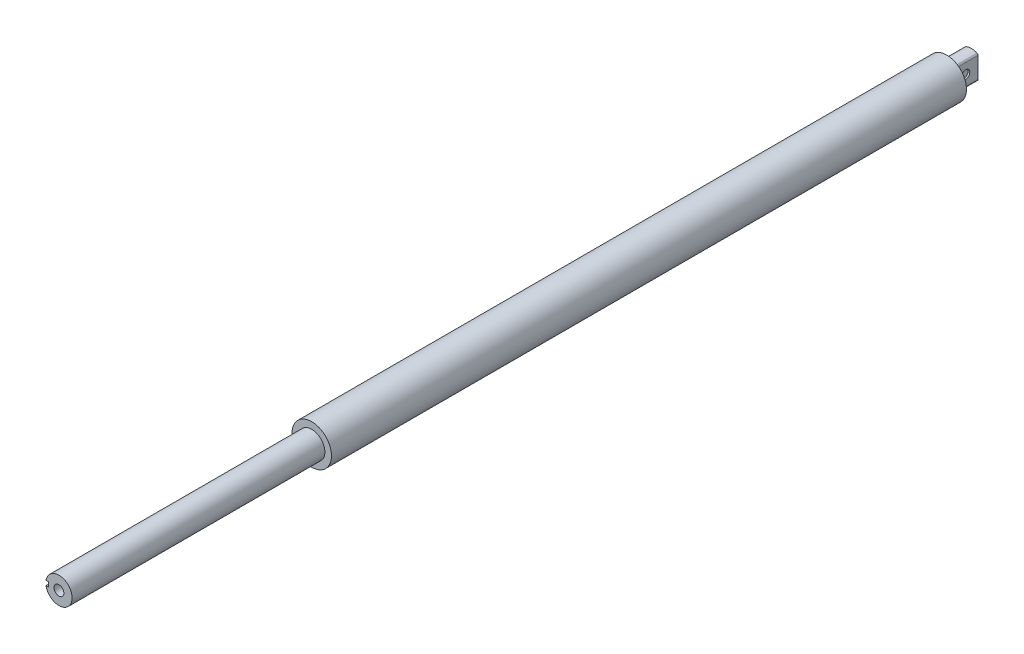
ISO-10303-21;
HEADER;
FILE_DESCRIPTION(('STEP AP214'),'2;1');
FILE_NAME('part.step','',(''),(''),'','','');
FILE_SCHEMA(('AUTOMOTIVE_DESIGN { 1 0 10303 214 1 1 1 1 }'));
ENDSEC;
DATA;
#1=APPLICATION_CONTEXT('core data for automotive mechanical design processes');
#2=APPLICATION_PROTOCOL_DEFINITION('international standard','automotive_design',2000,#1);
#3=PRODUCT_CONTEXT('',#1,'mechanical');
#4=PRODUCT('Part','Part','',(#3));
#5=PRODUCT_RELATED_PRODUCT_CATEGORY('part','',(#4));
#6=PRODUCT_DEFINITION_FORMATION('','',#4);
#7=PRODUCT_DEFINITION_CONTEXT('part definition',#1,'design');
#8=PRODUCT_DEFINITION('design','',#6,#7);
#9=PRODUCT_DEFINITION_SHAPE('','',#8);
#10=(LENGTH_UNIT() NAMED_UNIT(*) SI_UNIT(.MILLI.,.METRE.));
#11=(NAMED_UNIT(*) PLANE_ANGLE_UNIT() SI_UNIT($,.RADIAN.));
#12=(NAMED_UNIT(*) SI_UNIT($,.STERADIAN.) SOLID_ANGLE_UNIT());
#13=UNCERTAINTY_MEASURE_WITH_UNIT(LENGTH_MEASURE(1.E-05),#10,'distance_accuracy_value','');
#14=(GEOMETRIC_REPRESENTATION_CONTEXT(3) GLOBAL_UNCERTAINTY_ASSIGNED_CONTEXT((#13)) GLOBAL_UNIT_ASSIGNED_CONTEXT((#10,
#11,#12)) REPRESENTATION_CONTEXT('',''));
#15=CARTESIAN_POINT('',(0.,0.,0.));
#16=DIRECTION('',(0.,0.,1.));
#17=DIRECTION('',(1.,0.,0.));
#18=AXIS2_PLACEMENT_3D('',#15,#16,#17);
#19=CARTESIAN_POINT('',(0.,0.,-364.100348116694));
#20=DIRECTION('',(0.,0.,-1.));
#21=DIRECTION('',(-1.,0.,0.));
#22=AXIS2_PLACEMENT_3D('',#19,#20,#21);
#23=CYLINDRICAL_SURFACE('',#22,8.00000000000004);
#24=CARTESIAN_POINT('',(0.,0.,-277.5));
#25=DIRECTION('',(0.,0.,-1.));
#26=DIRECTION('',(-1.,0.,0.));
#27=AXIS2_PLACEMENT_3D('',#24,#25,#26);
#28=CIRCLE('',#27,8.00000000000004);
#29=CARTESIAN_POINT('',(-3.42857142857147,7.22806322324206,-277.5));
#30=VERTEX_POINT('',#29);
#31=CARTESIAN_POINT('',(3.42857142857138,7.22806322324206,-277.5));
#32=VERTEX_POINT('',#31);
#33=EDGE_CURVE('E167',#30,#32,#28,.T.);
#34=ORIENTED_EDGE('',*,*,#33,.F.);
#35=DIRECTION('',(0.,0.,-1.));
#36=VECTOR('',#35,1.);
#37=CARTESIAN_POINT('',(-3.42857142857147,7.22806322324206,-364.100348116694));
#38=LINE('',#37,#36);
#39=CARTESIAN_POINT('',(-3.42857142857147,7.22806322324206,-262.5));
#40=VERTEX_POINT('',#39);
#41=EDGE_CURVE('E52',#30,#40,#38,.F.);
#42=ORIENTED_EDGE('',*,*,#41,.T.);
#43=CARTESIAN_POINT('',(0.,0.,-262.5));
#44=DIRECTION('',(0.,0.,-1.));
#45=DIRECTION('',(-1.,0.,0.));
#46=AXIS2_PLACEMENT_3D('',#43,#44,#45);
#47=CIRCLE('',#46,8.00000000000004);
#48=CARTESIAN_POINT('',(3.42857142857138,7.22806322324206,-262.5));
#49=VERTEX_POINT('',#48);
#50=EDGE_CURVE('E168',#40,#49,#47,.T.);
#51=ORIENTED_EDGE('',*,*,#50,.T.);
#52=DIRECTION('',(0.,0.,-1.));
#53=VECTOR('',#52,1.);
#54=CARTESIAN_POINT('',(3.42857142857138,7.22806322324206,-364.100348116694));
#55=LINE('',#54,#53);
#56=EDGE_CURVE('E199',#49,#32,#55,.T.);
#57=ORIENTED_EDGE('',*,*,#56,.T.);
#58=EDGE_LOOP('',(#34,#42,#51,#57));
#59=FACE_BOUND('',#58,.T.);
#60=ADVANCED_FACE('F32',(#59),#23,.T.);
#61=CARTESIAN_POINT('',(0.,0.,-364.100348116694));
#62=DIRECTION('',(0.,0.,-1.));
#63=DIRECTION('',(-1.,0.,0.));
#64=AXIS2_PLACEMENT_3D('',#61,#62,#63);
#65=CYLINDRICAL_SURFACE('',#64,12.0000000000001);
#66=CARTESIAN_POINT('',(0.,0.,-262.5));
#67=DIRECTION('',(0.,0.,-1.));
#68=DIRECTION('',(-1.,0.,0.));
#69=AXIS2_PLACEMENT_3D('',#66,#67,#68);
#70=CIRCLE('',#69,12.0000000000001);
#71=CARTESIAN_POINT('',(-12.0000000000002,0.,-262.5));
#72=VERTEX_POINT('',#71);
#73=EDGE_CURVE('E170',#72,#72,#70,.T.);
#74=ORIENTED_EDGE('',*,*,#73,.F.);
#75=EDGE_LOOP('',(#74));
#76=FACE_BOUND('',#75,.T.);
#77=CARTESIAN_POINT('',(0.,0.,123.75));
#78=DIRECTION('',(0.,0.,1.));
#79=DIRECTION('',(1.,0.,0.));
#80=AXIS2_PLACEMENT_3D('',#77,#78,#79);
#81=CIRCLE('',#80,12.0000000000001);
#82=CARTESIAN_POINT('',(12.0000000000001,0.,123.75));
#83=VERTEX_POINT('',#82);
#84=EDGE_CURVE('E251',#83,#83,#81,.T.);
#85=ORIENTED_EDGE('',*,*,#84,.F.);
#86=EDGE_LOOP('',(#85));
#87=FACE_BOUND('',#86,.T.);
#88=ADVANCED_FACE('F281',(#76,#87),#65,.T.);
#89=CARTESIAN_POINT('',(12.0000000000001,0.,-262.5));
#90=DIRECTION('',(0.,0.,1.));
#91=DIRECTION('',(1.,0.,0.));
#92=AXIS2_PLACEMENT_3D('',#89,#90,#91);
#93=PLANE('',#92);
#94=ORIENTED_EDGE('',*,*,#50,.F.);
#95=CARTESIAN_POINT('',(-3.00000000000005,6.32455532033681,-262.5));
#96=DIRECTION('',(0.,0.,1.));
#97=DIRECTION('',(1.,0.,0.));
#98=AXIS2_PLACEMENT_3D('',#95,#96,#97);
#99=CIRCLE('',#98,1.);
#100=CARTESIAN_POINT('',(-4.00000000000005,6.32455532033681,-262.5));
#101=VERTEX_POINT('',#100);
#102=EDGE_CURVE('E40',#40,#101,#99,.T.);
#103=ORIENTED_EDGE('',*,*,#102,.T.);
#104=DIRECTION('',(0.,-1.,0.));
#105=VECTOR('',#104,1.);
#106=CARTESIAN_POINT('',(-4.00000000000005,-6.92820323027556,-262.5));
#107=LINE('',#106,#105);
#108=CARTESIAN_POINT('',(-4.00000000000005,-6.32455532033681,-262.5));
#109=VERTEX_POINT('',#108);
#110=EDGE_CURVE('E211',#101,#109,#107,.T.);
#111=ORIENTED_EDGE('',*,*,#110,.T.);
#112=CARTESIAN_POINT('',(-3.00000000000005,-6.32455532033681,-262.5));
#113=DIRECTION('',(0.,0.,1.));
#114=DIRECTION('',(1.,0.,0.));
#115=AXIS2_PLACEMENT_3D('',#112,#113,#114);
#116=CIRCLE('',#115,1.);
#117=CARTESIAN_POINT('',(-3.42857142857147,-7.22806322324206,-262.5));
#118=VERTEX_POINT('',#117);
#119=EDGE_CURVE('E205',#109,#118,#116,.T.);
#120=ORIENTED_EDGE('',*,*,#119,.T.);
#121=CARTESIAN_POINT('',(3.42857142857138,-7.22806322324206,-262.5));
#122=VERTEX_POINT('',#121);
#123=EDGE_CURVE('E171',#122,#118,#47,.T.);
#124=ORIENTED_EDGE('',*,*,#123,.F.);
#125=CARTESIAN_POINT('',(2.99999999999996,-6.32455532033681,-262.5));
#126=DIRECTION('',(0.,0.,1.));
#127=DIRECTION('',(1.,0.,0.));
#128=AXIS2_PLACEMENT_3D('',#125,#126,#127);
#129=CIRCLE('',#128,1.);
#130=CARTESIAN_POINT('',(3.99999999999996,-6.32455532033681,-262.5));
#131=VERTEX_POINT('',#130);
#132=EDGE_CURVE('E203',#122,#131,#129,.T.);
#133=ORIENTED_EDGE('',*,*,#132,.T.);
#134=DIRECTION('',(0.,1.,0.));
#135=VECTOR('',#134,1.);
#136=CARTESIAN_POINT('',(3.99999999999996,6.92820323027556,-262.5));
#137=LINE('',#136,#135);
#138=CARTESIAN_POINT('',(3.99999999999996,6.32455532033681,-262.5));
#139=VERTEX_POINT('',#138);
#140=EDGE_CURVE('E245',#131,#139,#137,.T.);
#141=ORIENTED_EDGE('',*,*,#140,.T.);
#142=CARTESIAN_POINT('',(2.99999999999996,6.32455532033681,-262.5));
#143=DIRECTION('',(0.,0.,1.));
#144=DIRECTION('',(1.,0.,0.));
#145=AXIS2_PLACEMENT_3D('',#142,#143,#144);
#146=CIRCLE('',#145,1.);
#147=EDGE_CURVE('E11',#139,#49,#146,.T.);
#148=ORIENTED_EDGE('',*,*,#147,.T.);
#149=EDGE_LOOP('',(#94,#103,#111,#120,#124,#133,#141,#148));
#150=FACE_BOUND('',#149,.T.);
#151=ORIENTED_EDGE('',*,*,#73,.T.);
#152=EDGE_LOOP('',(#151));
#153=FACE_BOUND('',#152,.T.);
#154=ADVANCED_FACE('F209',(#150,#153),#93,.F.);
#155=CARTESIAN_POINT('',(3.42857142857138,-7.22806322324206,-277.5));
#156=VERTEX_POINT('',#155);
#157=CARTESIAN_POINT('',(-3.42857142857147,-7.22806322324206,-277.5));
#158=VERTEX_POINT('',#157);
#159=EDGE_CURVE('E162',#156,#158,#28,.T.);
#160=ORIENTED_EDGE('',*,*,#159,.F.);
#161=DIRECTION('',(0.,0.,-1.));
#162=VECTOR('',#161,1.);
#163=CARTESIAN_POINT('',(3.42857142857138,-7.22806322324206,-364.100348116694));
#164=LINE('',#163,#162);
#165=EDGE_CURVE('E192',#156,#122,#164,.F.);
#166=ORIENTED_EDGE('',*,*,#165,.T.);
#167=ORIENTED_EDGE('',*,*,#123,.T.);
#168=DIRECTION('',(0.,0.,-1.));
#169=VECTOR('',#168,1.);
#170=CARTESIAN_POINT('',(-3.42857142857147,-7.22806322324206,-364.100348116694));
#171=LINE('',#170,#169);
#172=EDGE_CURVE('E189',#118,#158,#171,.T.);
#173=ORIENTED_EDGE('',*,*,#172,.T.);
#174=EDGE_LOOP('',(#160,#166,#167,#173));
#175=FACE_BOUND('',#174,.T.);
#176=ADVANCED_FACE('F234',(#175),#23,.T.);
#177=CARTESIAN_POINT('',(8.,0.,-277.5));
#178=DIRECTION('',(0.,0.,1.));
#179=DIRECTION('',(1.,0.,0.));
#180=AXIS2_PLACEMENT_3D('',#177,#178,#179);
#181=PLANE('',#180);
#182=DIRECTION('',(0.,1.,0.));
#183=VECTOR('',#182,1.);
#184=CARTESIAN_POINT('',(3.99999999999996,6.92820323027556,-277.5));
#185=LINE('',#184,#183);
#186=CARTESIAN_POINT('',(3.99999999999996,-6.32455532033681,-277.5));
#187=VERTEX_POINT('',#186);
#188=CARTESIAN_POINT('',(3.99999999999996,6.32455532033681,-277.5));
#189=VERTEX_POINT('',#188);
#190=EDGE_CURVE('E220',#187,#189,#185,.T.);
#191=ORIENTED_EDGE('',*,*,#190,.F.);
#192=CARTESIAN_POINT('',(2.99999999999996,-6.32455532033681,-277.5));
#193=DIRECTION('',(0.,0.,1.));
#194=DIRECTION('',(1.,0.,0.));
#195=AXIS2_PLACEMENT_3D('',#192,#193,#194);
#196=CIRCLE('',#195,1.);
#197=EDGE_CURVE('E187',#187,#156,#196,.F.);
#198=ORIENTED_EDGE('',*,*,#197,.T.);
#199=ORIENTED_EDGE('',*,*,#159,.T.);
#200=CARTESIAN_POINT('',(-3.00000000000005,-6.32455532033681,-277.5));
#201=DIRECTION('',(0.,0.,1.));
#202=DIRECTION('',(1.,0.,0.));
#203=AXIS2_PLACEMENT_3D('',#200,#201,#202);
#204=CIRCLE('',#203,1.);
#205=CARTESIAN_POINT('',(-4.00000000000005,-6.32455532033681,-277.5));
#206=VERTEX_POINT('',#205);
#207=EDGE_CURVE('E185',#158,#206,#204,.F.);
#208=ORIENTED_EDGE('',*,*,#207,.T.);
#209=DIRECTION('',(0.,-1.,0.));
#210=VECTOR('',#209,1.);
#211=CARTESIAN_POINT('',(-4.00000000000005,-6.92820323027556,-277.5));
#212=LINE('',#211,#210);
#213=CARTESIAN_POINT('',(-4.00000000000005,6.32455532033681,-277.5));
#214=VERTEX_POINT('',#213);
#215=EDGE_CURVE('E221',#214,#206,#212,.T.);
#216=ORIENTED_EDGE('',*,*,#215,.F.);
#217=CARTESIAN_POINT('',(-3.00000000000005,6.32455532033681,-277.5));
#218=DIRECTION('',(0.,0.,1.));
#219=DIRECTION('',(1.,0.,0.));
#220=AXIS2_PLACEMENT_3D('',#217,#218,#219);
#221=CIRCLE('',#220,1.);
#222=EDGE_CURVE('E183',#214,#30,#221,.F.);
#223=ORIENTED_EDGE('',*,*,#222,.T.);
#224=ORIENTED_EDGE('',*,*,#33,.T.);
#225=CARTESIAN_POINT('',(2.99999999999996,6.32455532033681,-277.5));
#226=DIRECTION('',(0.,0.,1.));
#227=DIRECTION('',(1.,0.,0.));
#228=AXIS2_PLACEMENT_3D('',#225,#226,#227);
#229=CIRCLE('',#228,1.);
#230=EDGE_CURVE('E181',#32,#189,#229,.F.);
#231=ORIENTED_EDGE('',*,*,#230,.T.);
#232=EDGE_LOOP('',(#191,#198,#199,#208,#216,#223,#224,#231));
#233=FACE_BOUND('',#232,.T.);
#234=ADVANCED_FACE('F227',(#233),#181,.F.);
#235=CARTESIAN_POINT('',(0.,0.,123.75));
#236=DIRECTION('',(0.,0.,1.));
#237=DIRECTION('',(1.,0.,0.));
#238=AXIS2_PLACEMENT_3D('',#235,#236,#237);
#239=PLANE('',#238);
#240=CARTESIAN_POINT('',(0.,0.,123.75));
#241=DIRECTION('',(0.,0.,1.));
#242=DIRECTION('',(1.,0.,0.));
#243=AXIS2_PLACEMENT_3D('',#240,#241,#242);
#244=CIRCLE('',#243,8.00000000000004);
#245=CARTESIAN_POINT('',(8.00000000000005,0.,123.75));
#246=VERTEX_POINT('',#245);
#247=EDGE_CURVE('E248',#246,#246,#244,.T.);
#248=ORIENTED_EDGE('',*,*,#247,.F.);
#249=EDGE_LOOP('',(#248));
#250=FACE_BOUND('',#249,.T.);
#251=ORIENTED_EDGE('',*,*,#84,.T.);
#252=EDGE_LOOP('',(#251));
#253=FACE_BOUND('',#252,.T.);
#254=ADVANCED_FACE('F295',(#250,#253),#239,.T.);
#255=CARTESIAN_POINT('',(0.,0.,237.5));
#256=DIRECTION('',(0.,0.,1.));
#257=DIRECTION('',(1.,0.,0.));
#258=AXIS2_PLACEMENT_3D('',#255,#256,#257);
#259=PLANE('',#258);
#260=CARTESIAN_POINT('',(0.,0.,237.5));
#261=DIRECTION('',(0.,0.,1.));
#262=DIRECTION('',(1.,0.,0.));
#263=AXIS2_PLACEMENT_3D('',#260,#261,#262);
#264=CIRCLE('',#263,3.);
#265=CARTESIAN_POINT('',(2.99999999999994,0.,237.5));
#266=VERTEX_POINT('',#265);
#267=EDGE_CURVE('E156',#266,#266,#264,.T.);
#268=ORIENTED_EDGE('',*,*,#267,.T.);
#269=EDGE_LOOP('',(#268));
#270=FACE_BOUND('',#269,.T.);
#271=ADVANCED_FACE('F337',(#270),#259,.T.);
#272=CARTESIAN_POINT('',(0.,0.,237.5));
#273=DIRECTION('',(0.,0.,1.));
#274=DIRECTION('',(1.,0.,0.));
#275=AXIS2_PLACEMENT_3D('',#272,#273,#274);
#276=CYLINDRICAL_SURFACE('',#275,3.);
#277=ORIENTED_EDGE('',*,*,#267,.F.);
#278=EDGE_LOOP('',(#277));
#279=FACE_BOUND('',#278,.T.);
#280=CARTESIAN_POINT('',(0.,0.,277.5));
#281=DIRECTION('',(0.,0.,1.));
#282=DIRECTION('',(1.,0.,0.));
#283=AXIS2_PLACEMENT_3D('',#280,#281,#282);
#284=CIRCLE('',#283,3.);
#285=CARTESIAN_POINT('',(2.99999999999994,0.,277.5));
#286=VERTEX_POINT('',#285);
#287=EDGE_CURVE('E254',#286,#286,#284,.T.);
#288=ORIENTED_EDGE('',*,*,#287,.T.);
#289=EDGE_LOOP('',(#288));
#290=FACE_BOUND('',#289,.T.);
#291=ADVANCED_FACE('F259',(#279,#290),#276,.F.);
#292=CARTESIAN_POINT('',(0.,0.,277.5));
#293=DIRECTION('',(0.,0.,-1.));
#294=DIRECTION('',(-1.,0.,0.));
#295=AXIS2_PLACEMENT_3D('',#292,#293,#294);
#296=PLANE('',#295);
#297=ORIENTED_EDGE('',*,*,#287,.F.);
#298=EDGE_LOOP('',(#297));
#299=FACE_BOUND('',#298,.T.);
#300=DIRECTION('',(0.,1.,0.));
#301=VECTOR('',#300,1.);
#302=CARTESIAN_POINT('',(-6.48831834848031,1.39,277.5));
#303=LINE('',#302,#301);
#304=CARTESIAN_POINT('',(-6.48831834848031,-1.39,277.5));
#305=VERTEX_POINT('',#304);
#306=CARTESIAN_POINT('',(-6.48831834848031,1.39,277.5));
#307=VERTEX_POINT('',#306);
#308=EDGE_CURVE('E153',#305,#307,#303,.T.);
#309=ORIENTED_EDGE('',*,*,#308,.F.);
#310=DIRECTION('',(1.,0.,0.));
#311=VECTOR('',#310,1.);
#312=CARTESIAN_POINT('',(-6.48831834848031,-1.39,277.5));
#313=LINE('',#312,#311);
#314=CARTESIAN_POINT('',(-7.87831834848031,-1.39,277.5));
#315=VERTEX_POINT('',#314);
#316=EDGE_CURVE('E148',#315,#305,#313,.T.);
#317=ORIENTED_EDGE('',*,*,#316,.F.);
#318=CARTESIAN_POINT('',(0.,0.,277.5));
#319=DIRECTION('',(0.,0.,-1.));
#320=DIRECTION('',(-1.,0.,0.));
#321=AXIS2_PLACEMENT_3D('',#318,#319,#320);
#322=CIRCLE('',#321,8.00000000000004);
#323=CARTESIAN_POINT('',(-7.87831834848031,1.39,277.5));
#324=VERTEX_POINT('',#323);
#325=EDGE_CURVE('E174',#324,#315,#322,.T.);
#326=ORIENTED_EDGE('',*,*,#325,.F.);
#327=DIRECTION('',(-1.,0.,0.));
#328=VECTOR('',#327,1.);
#329=CARTESIAN_POINT('',(-6.48831834848031,1.39,277.5));
#330=LINE('',#329,#328);
#331=EDGE_CURVE('E140',#307,#324,#330,.T.);
#332=ORIENTED_EDGE('',*,*,#331,.F.);
#333=EDGE_LOOP('',(#309,#317,#326,#332));
#334=FACE_BOUND('',#333,.T.);
#335=ADVANCED_FACE('F261',(#299,#334),#296,.F.);
#336=CARTESIAN_POINT('',(-6.48831834848031,1.39,247.5));
#337=DIRECTION('',(1.,0.,0.));
#338=DIRECTION('',(0.,1.,0.));
#339=AXIS2_PLACEMENT_3D('',#336,#337,#338);
#340=PLANE('',#339);
#341=ORIENTED_EDGE('',*,*,#308,.T.);
#342=DIRECTION('',(0.,0.,1.));
#343=VECTOR('',#342,1.);
#344=CARTESIAN_POINT('',(-6.48831834848031,1.39,247.5));
#345=LINE('',#344,#343);
#346=CARTESIAN_POINT('',(-6.48831834848031,1.39,247.5));
#347=VERTEX_POINT('',#346);
#348=EDGE_CURVE('E142',#347,#307,#345,.T.);
#349=ORIENTED_EDGE('',*,*,#348,.F.);
#350=DIRECTION('',(0.,1.,0.));
#351=VECTOR('',#350,1.);
#352=CARTESIAN_POINT('',(-6.48831834848031,1.39,247.5));
#353=LINE('',#352,#351);
#354=CARTESIAN_POINT('',(-6.48831834848031,-1.39,247.5));
#355=VERTEX_POINT('',#354);
#356=EDGE_CURVE('E146',#355,#347,#353,.T.);
#357=ORIENTED_EDGE('',*,*,#356,.F.);
#358=DIRECTION('',(0.,0.,1.));
#359=VECTOR('',#358,1.);
#360=CARTESIAN_POINT('',(-6.48831834848031,-1.39,247.5));
#361=LINE('',#360,#359);
#362=EDGE_CURVE('E160',#355,#305,#361,.T.);
#363=ORIENTED_EDGE('',*,*,#362,.T.);
#364=EDGE_LOOP('',(#341,#349,#357,#363));
#365=FACE_BOUND('',#364,.T.);
#366=ADVANCED_FACE('F264',(#365),#340,.F.);
#367=CARTESIAN_POINT('',(0.,0.,247.5));
#368=DIRECTION('',(0.,0.,1.));
#369=DIRECTION('',(1.,0.,0.));
#370=AXIS2_PLACEMENT_3D('',#367,#368,#369);
#371=PLANE('',#370);
#372=ORIENTED_EDGE('',*,*,#356,.T.);
#373=DIRECTION('',(-1.,0.,0.));
#374=VECTOR('',#373,1.);
#375=CARTESIAN_POINT('',(-6.48831834848031,1.39,247.5));
#376=LINE('',#375,#374);
#377=CARTESIAN_POINT('',(-7.87831834848026,1.39,247.5));
#378=VERTEX_POINT('',#377);
#379=EDGE_CURVE('E133',#347,#378,#376,.T.);
#380=ORIENTED_EDGE('',*,*,#379,.T.);
#381=CARTESIAN_POINT('',(0.,0.,247.5));
#382=DIRECTION('',(0.,0.,1.));
#383=DIRECTION('',(1.,0.,0.));
#384=AXIS2_PLACEMENT_3D('',#381,#382,#383);
#385=CIRCLE('',#384,8.00000000000009);
#386=CARTESIAN_POINT('',(-7.87831834848031,-1.39,247.5));
#387=VERTEX_POINT('',#386);
#388=EDGE_CURVE('E120',#378,#387,#385,.T.);
#389=ORIENTED_EDGE('',*,*,#388,.T.);
#390=DIRECTION('',(1.,0.,0.));
#391=VECTOR('',#390,1.);
#392=CARTESIAN_POINT('',(-6.48831834848031,-1.39,247.5));
#393=LINE('',#392,#391);
#394=EDGE_CURVE('E132',#387,#355,#393,.T.);
#395=ORIENTED_EDGE('',*,*,#394,.T.);
#396=EDGE_LOOP('',(#372,#380,#389,#395));
#397=FACE_BOUND('',#396,.T.);
#398=ADVANCED_FACE('F144',(#397),#371,.T.);
#399=CARTESIAN_POINT('',(-6.48831834848031,1.39,247.5));
#400=DIRECTION('',(0.,1.,0.));
#401=DIRECTION('',(-1.,0.,0.));
#402=AXIS2_PLACEMENT_3D('',#399,#400,#401);
#403=PLANE('',#402);
#404=ORIENTED_EDGE('',*,*,#331,.T.);
#405=DIRECTION('',(0.,0.,1.));
#406=VECTOR('',#405,1.);
#407=CARTESIAN_POINT('',(-7.87831834848031,1.39,247.5));
#408=LINE('',#407,#406);
#409=EDGE_CURVE('E125',#378,#324,#408,.T.);
#410=ORIENTED_EDGE('',*,*,#409,.F.);
#411=ORIENTED_EDGE('',*,*,#379,.F.);
#412=ORIENTED_EDGE('',*,*,#348,.T.);
#413=EDGE_LOOP('',(#404,#410,#411,#412));
#414=FACE_BOUND('',#413,.T.);
#415=ADVANCED_FACE('F137',(#414),#403,.F.);
#416=CARTESIAN_POINT('',(-6.48831834848031,-1.39,247.5));
#417=DIRECTION('',(0.,-1.,0.));
#418=DIRECTION('',(0.,0.,-1.));
#419=AXIS2_PLACEMENT_3D('',#416,#417,#418);
#420=PLANE('',#419);
#421=ORIENTED_EDGE('',*,*,#316,.T.);
#422=ORIENTED_EDGE('',*,*,#362,.F.);
#423=ORIENTED_EDGE('',*,*,#394,.F.);
#424=DIRECTION('',(0.,0.,1.));
#425=VECTOR('',#424,1.);
#426=CARTESIAN_POINT('',(-7.87831834848031,-1.39,247.5));
#427=LINE('',#426,#425);
#428=EDGE_CURVE('E127',#387,#315,#427,.T.);
#429=ORIENTED_EDGE('',*,*,#428,.T.);
#430=EDGE_LOOP('',(#421,#422,#423,#429));
#431=FACE_BOUND('',#430,.T.);
#432=ADVANCED_FACE('F270',(#431),#420,.F.);
#433=CARTESIAN_POINT('',(0.,0.,-364.100348116694));
#434=DIRECTION('',(0.,0.,-1.));
#435=DIRECTION('',(-1.,0.,0.));
#436=AXIS2_PLACEMENT_3D('',#433,#434,#435);
#437=CYLINDRICAL_SURFACE('',#436,8.00000000000004);
#438=ORIENTED_EDGE('',*,*,#325,.T.);
#439=ORIENTED_EDGE('',*,*,#428,.F.);
#440=ORIENTED_EDGE('',*,*,#388,.F.);
#441=ORIENTED_EDGE('',*,*,#409,.T.);
#442=EDGE_LOOP('',(#438,#439,#440,#441));
#443=FACE_BOUND('',#442,.T.);
#444=ORIENTED_EDGE('',*,*,#247,.T.);
#445=EDGE_LOOP('',(#444));
#446=FACE_BOUND('',#445,.T.);
#447=ADVANCED_FACE('F123',(#443,#446),#437,.T.);
#448=CARTESIAN_POINT('',(-4.00000000000005,-6.92820323027556,-248.077794898144));
#449=DIRECTION('',(1.,0.,0.));
#450=DIRECTION('',(0.,0.,-1.));
#451=AXIS2_PLACEMENT_3D('',#448,#449,#450);
#452=PLANE('',#451);
#453=ORIENTED_EDGE('',*,*,#215,.T.);
#454=DIRECTION('',(0.,0.,-1.));
#455=VECTOR('',#454,1.);
#456=CARTESIAN_POINT('',(-4.00000000000005,-6.32455532033681,-248.077794898144));
#457=LINE('',#456,#455);
#458=EDGE_CURVE('E197',#206,#109,#457,.F.);
#459=ORIENTED_EDGE('',*,*,#458,.T.);
#460=ORIENTED_EDGE('',*,*,#110,.F.);
#461=DIRECTION('',(0.,0.,-1.));
#462=VECTOR('',#461,1.);
#463=CARTESIAN_POINT('',(-4.00000000000005,6.32455532033681,-248.077794898144));
#464=LINE('',#463,#462);
#465=EDGE_CURVE('E194',#101,#214,#464,.T.);
#466=ORIENTED_EDGE('',*,*,#465,.T.);
#467=EDGE_LOOP('',(#453,#459,#460,#466));
#468=FACE_BOUND('',#467,.T.);
#469=ADVANCED_FACE('F217',(#468),#452,.F.);
#470=CARTESIAN_POINT('',(3.99999999999996,6.92820323027556,-248.077794898144));
#471=DIRECTION('',(-1.,0.,0.));
#472=DIRECTION('',(0.,0.,1.));
#473=AXIS2_PLACEMENT_3D('',#470,#471,#472);
#474=PLANE('',#473);
#475=CARTESIAN_POINT('',(3.99999999999996,0.,-270.));
#476=DIRECTION('',(1.,0.,0.));
#477=DIRECTION('',(0.,0.,-1.));
#478=AXIS2_PLACEMENT_3D('',#475,#476,#477);
#479=CIRCLE('',#478,2.50000000000002);
#480=CARTESIAN_POINT('',(3.99999999999996,0.,-272.5));
#481=VERTEX_POINT('',#480);
#482=EDGE_CURVE('E242',#481,#481,#479,.T.);
#483=ORIENTED_EDGE('',*,*,#482,.F.);
#484=EDGE_LOOP('',(#483));
#485=FACE_BOUND('',#484,.T.);
#486=ORIENTED_EDGE('',*,*,#140,.F.);
#487=DIRECTION('',(0.,0.,-1.));
#488=VECTOR('',#487,1.);
#489=CARTESIAN_POINT('',(3.99999999999996,-6.32455532033681,-248.077794898144));
#490=LINE('',#489,#488);
#491=EDGE_CURVE('E178',#131,#187,#490,.T.);
#492=ORIENTED_EDGE('',*,*,#491,.T.);
#493=ORIENTED_EDGE('',*,*,#190,.T.);
#494=DIRECTION('',(0.,0.,-1.));
#495=VECTOR('',#494,1.);
#496=CARTESIAN_POINT('',(3.99999999999996,6.32455532033681,-248.077794898144));
#497=LINE('',#496,#495);
#498=EDGE_CURVE('E176',#189,#139,#497,.F.);
#499=ORIENTED_EDGE('',*,*,#498,.T.);
#500=EDGE_LOOP('',(#486,#492,#493,#499));
#501=FACE_BOUND('',#500,.T.);
#502=ADVANCED_FACE('F302',(#485,#501),#474,.F.);
#503=CARTESIAN_POINT('',(2.99999999999996,-6.32455532033681,-364.100348116694));
#504=DIRECTION('',(0.,0.,-1.));
#505=DIRECTION('',(-1.,0.,0.));
#506=AXIS2_PLACEMENT_3D('',#503,#504,#505);
#507=CYLINDRICAL_SURFACE('',#506,1.);
#508=ORIENTED_EDGE('',*,*,#132,.F.);
#509=ORIENTED_EDGE('',*,*,#165,.F.);
#510=ORIENTED_EDGE('',*,*,#197,.F.);
#511=ORIENTED_EDGE('',*,*,#491,.F.);
#512=EDGE_LOOP('',(#508,#509,#510,#511));
#513=FACE_BOUND('',#512,.T.);
#514=ADVANCED_FACE('F299',(#513),#507,.T.);
#515=CARTESIAN_POINT('',(-3.00000000000005,-6.32455532033681,-364.100348116694));
#516=DIRECTION('',(0.,0.,-1.));
#517=DIRECTION('',(-1.,0.,0.));
#518=AXIS2_PLACEMENT_3D('',#515,#516,#517);
#519=CYLINDRICAL_SURFACE('',#518,1.);
#520=ORIENTED_EDGE('',*,*,#119,.F.);
#521=ORIENTED_EDGE('',*,*,#458,.F.);
#522=ORIENTED_EDGE('',*,*,#207,.F.);
#523=ORIENTED_EDGE('',*,*,#172,.F.);
#524=EDGE_LOOP('',(#520,#521,#522,#523));
#525=FACE_BOUND('',#524,.T.);
#526=ADVANCED_FACE('F238',(#525),#519,.T.);
#527=CARTESIAN_POINT('',(-3.00000000000005,6.32455532033681,-364.100348116694));
#528=DIRECTION('',(0.,0.,-1.));
#529=DIRECTION('',(-1.,0.,0.));
#530=AXIS2_PLACEMENT_3D('',#527,#528,#529);
#531=CYLINDRICAL_SURFACE('',#530,1.);
#532=ORIENTED_EDGE('',*,*,#102,.F.);
#533=ORIENTED_EDGE('',*,*,#41,.F.);
#534=ORIENTED_EDGE('',*,*,#222,.F.);
#535=ORIENTED_EDGE('',*,*,#465,.F.);
#536=EDGE_LOOP('',(#532,#533,#534,#535));
#537=FACE_BOUND('',#536,.T.);
#538=ADVANCED_FACE('F223',(#537),#531,.T.);
#539=CARTESIAN_POINT('',(2.99999999999996,6.32455532033681,-364.100348116694));
#540=DIRECTION('',(0.,0.,-1.));
#541=DIRECTION('',(-1.,0.,0.));
#542=AXIS2_PLACEMENT_3D('',#539,#540,#541);
#543=CYLINDRICAL_SURFACE('',#542,1.);
#544=ORIENTED_EDGE('',*,*,#147,.F.);
#545=ORIENTED_EDGE('',*,*,#498,.F.);
#546=ORIENTED_EDGE('',*,*,#230,.F.);
#547=ORIENTED_EDGE('',*,*,#56,.F.);
#548=EDGE_LOOP('',(#544,#545,#546,#547));
#549=FACE_BOUND('',#548,.T.);
#550=ADVANCED_FACE('F34',(#549),#543,.T.);
#551=CARTESIAN_POINT('',(2.99999999999996,0.,-270.));
#552=DIRECTION('',(1.,0.,0.));
#553=DIRECTION('',(0.,0.,-1.));
#554=AXIS2_PLACEMENT_3D('',#551,#552,#553);
#555=CYLINDRICAL_SURFACE('',#554,2.50000000000002);
#556=CARTESIAN_POINT('',(2.99999999999996,0.,-270.));
#557=DIRECTION('',(1.,0.,0.));
#558=DIRECTION('',(0.,0.,-1.));
#559=AXIS2_PLACEMENT_3D('',#556,#557,#558);
#560=CIRCLE('',#559,2.50000000000002);
#561=CARTESIAN_POINT('',(2.99999999999996,0.,-272.5));
#562=VERTEX_POINT('',#561);
#563=EDGE_CURVE('E239',#562,#562,#560,.T.);
#564=ORIENTED_EDGE('',*,*,#563,.F.);
#565=EDGE_LOOP('',(#564));
#566=FACE_BOUND('',#565,.T.);
#567=ORIENTED_EDGE('',*,*,#482,.T.);
#568=EDGE_LOOP('',(#567));
#569=FACE_BOUND('',#568,.T.);
#570=ADVANCED_FACE('F309',(#566,#569),#555,.F.);
#571=CARTESIAN_POINT('',(2.99999999999996,0.,-270.));
#572=DIRECTION('',(1.,0.,0.));
#573=DIRECTION('',(0.,0.,-1.));
#574=AXIS2_PLACEMENT_3D('',#571,#572,#573);
#575=PLANE('',#574);
#576=ORIENTED_EDGE('',*,*,#563,.T.);
#577=EDGE_LOOP('',(#576));
#578=FACE_BOUND('',#577,.T.);
#579=ADVANCED_FACE('F314',(#578),#575,.T.);
#580=CLOSED_SHELL('',(#60,#88,#154,#176,#234,#254,#271,#291,#335,#366,#398,#415,#432,#447,#469,
#502,#514,#526,#538,#550,#570,#579));
#581=MANIFOLD_SOLID_BREP('B2',#580);
#582=ADVANCED_BREP_SHAPE_REPRESENTATION('',(#18,#581),#14);
#583=SHAPE_DEFINITION_REPRESENTATION(#9,#582);
ENDSEC;
END-ISO-10303-21;
